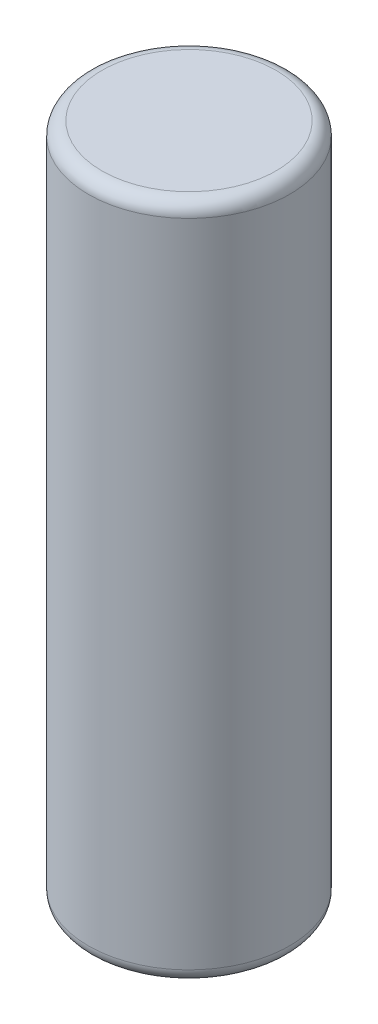
ISO-10303-21;
HEADER;
FILE_DESCRIPTION(('STEP AP214'),'2;1');
FILE_NAME('part.step','',(''),(''),'','','');
FILE_SCHEMA(('AUTOMOTIVE_DESIGN { 1 0 10303 214 1 1 1 1 }'));
ENDSEC;
DATA;
#1=APPLICATION_CONTEXT('core data for automotive mechanical design processes');
#2=APPLICATION_PROTOCOL_DEFINITION('international standard','automotive_design',2000,#1);
#3=PRODUCT_CONTEXT('',#1,'mechanical');
#4=PRODUCT('Part','Part','',(#3));
#5=PRODUCT_RELATED_PRODUCT_CATEGORY('part','',(#4));
#6=PRODUCT_DEFINITION_FORMATION('','',#4);
#7=PRODUCT_DEFINITION_CONTEXT('part definition',#1,'design');
#8=PRODUCT_DEFINITION('design','',#6,#7);
#9=PRODUCT_DEFINITION_SHAPE('','',#8);
#10=(LENGTH_UNIT() NAMED_UNIT(*) SI_UNIT(.MILLI.,.METRE.));
#11=(NAMED_UNIT(*) PLANE_ANGLE_UNIT() SI_UNIT($,.RADIAN.));
#12=(NAMED_UNIT(*) SI_UNIT($,.STERADIAN.) SOLID_ANGLE_UNIT());
#13=UNCERTAINTY_MEASURE_WITH_UNIT(LENGTH_MEASURE(1.E-05),#10,'distance_accuracy_value','');
#14=(GEOMETRIC_REPRESENTATION_CONTEXT(3) GLOBAL_UNCERTAINTY_ASSIGNED_CONTEXT((#13)) GLOBAL_UNIT_ASSIGNED_CONTEXT((#10,
#11,#12)) REPRESENTATION_CONTEXT('',''));
#15=CARTESIAN_POINT('',(0.,0.,0.));
#16=DIRECTION('',(0.,0.,1.));
#17=DIRECTION('',(1.,0.,0.));
#18=AXIS2_PLACEMENT_3D('',#15,#16,#17);
#19=CARTESIAN_POINT('',(0.,50.,0.));
#20=DIRECTION('',(0.,-1.,0.));
#21=DIRECTION('',(0.,0.,-1.));
#22=AXIS2_PLACEMENT_3D('',#19,#20,#21);
#23=CYLINDRICAL_SURFACE('',#22,7.425);
#24=CARTESIAN_POINT('',(0.,1.,0.));
#25=DIRECTION('',(0.,1.,0.));
#26=DIRECTION('',(0.,0.,1.));
#27=AXIS2_PLACEMENT_3D('',#24,#25,#26);
#28=CIRCLE('',#27,7.425);
#29=CARTESIAN_POINT('',(0.,1.,7.425));
#30=VERTEX_POINT('',#29);
#31=EDGE_CURVE('E48',#30,#30,#28,.T.);
#32=ORIENTED_EDGE('',*,*,#31,.T.);
#33=EDGE_LOOP('',(#32));
#34=FACE_BOUND('',#33,.T.);
#35=CARTESIAN_POINT('',(0.,49.,0.));
#36=DIRECTION('',(0.,1.,0.));
#37=DIRECTION('',(0.,0.,1.));
#38=AXIS2_PLACEMENT_3D('',#35,#36,#37);
#39=CIRCLE('',#38,7.425);
#40=CARTESIAN_POINT('',(0.,49.,7.425));
#41=VERTEX_POINT('',#40);
#42=EDGE_CURVE('E52',#41,#41,#39,.F.);
#43=ORIENTED_EDGE('',*,*,#42,.T.);
#44=EDGE_LOOP('',(#43));
#45=FACE_BOUND('',#44,.T.);
#46=ADVANCED_FACE('F37',(#34,#45),#23,.T.);
#47=CARTESIAN_POINT('',(0.,50.,0.));
#48=DIRECTION('',(0.,1.,0.));
#49=DIRECTION('',(0.,0.,1.));
#50=AXIS2_PLACEMENT_3D('',#47,#48,#49);
#51=PLANE('',#50);
#52=CARTESIAN_POINT('',(0.,50.,0.));
#53=DIRECTION('',(0.,1.,0.));
#54=DIRECTION('',(0.,0.,1.));
#55=AXIS2_PLACEMENT_3D('',#52,#53,#54);
#56=CIRCLE('',#55,6.425);
#57=CARTESIAN_POINT('',(0.,50.,6.425));
#58=VERTEX_POINT('',#57);
#59=EDGE_CURVE('E10',#58,#58,#56,.T.);
#60=ORIENTED_EDGE('',*,*,#59,.T.);
#61=EDGE_LOOP('',(#60));
#62=FACE_BOUND('',#61,.T.);
#63=ADVANCED_FACE('F68',(#62),#51,.T.);
#64=CARTESIAN_POINT('',(0.,0.,0.));
#65=DIRECTION('',(0.,1.,0.));
#66=DIRECTION('',(0.,0.,1.));
#67=AXIS2_PLACEMENT_3D('',#64,#65,#66);
#68=PLANE('',#67);
#69=CARTESIAN_POINT('',(0.,0.,0.));
#70=DIRECTION('',(0.,1.,0.));
#71=DIRECTION('',(0.,0.,1.));
#72=AXIS2_PLACEMENT_3D('',#69,#70,#71);
#73=CIRCLE('',#72,6.425);
#74=CARTESIAN_POINT('',(0.,0.,6.425));
#75=VERTEX_POINT('',#74);
#76=EDGE_CURVE('E44',#75,#75,#73,.F.);
#77=ORIENTED_EDGE('',*,*,#76,.T.);
#78=EDGE_LOOP('',(#77));
#79=FACE_BOUND('',#78,.T.);
#80=ADVANCED_FACE('F65',(#79),#68,.F.);
#81=CARTESIAN_POINT('',(0.,1.,0.));
#82=DIRECTION('',(0.,1.,0.));
#83=DIRECTION('',(0.,0.,1.));
#84=AXIS2_PLACEMENT_3D('',#81,#82,#83);
#85=TOROIDAL_SURFACE('',#84,6.425,1.);
#86=ORIENTED_EDGE('',*,*,#76,.F.);
#87=EDGE_LOOP('',(#86));
#88=FACE_BOUND('',#87,.T.);
#89=ORIENTED_EDGE('',*,*,#31,.F.);
#90=EDGE_LOOP('',(#89));
#91=FACE_BOUND('',#90,.T.);
#92=ADVANCED_FACE('F61',(#88,#91),#85,.T.);
#93=CARTESIAN_POINT('',(0.,49.,0.));
#94=DIRECTION('',(0.,1.,0.));
#95=DIRECTION('',(0.,0.,1.));
#96=AXIS2_PLACEMENT_3D('',#93,#94,#95);
#97=TOROIDAL_SURFACE('',#96,6.425,1.);
#98=ORIENTED_EDGE('',*,*,#42,.F.);
#99=EDGE_LOOP('',(#98));
#100=FACE_BOUND('',#99,.T.);
#101=ORIENTED_EDGE('',*,*,#59,.F.);
#102=EDGE_LOOP('',(#101));
#103=FACE_BOUND('',#102,.T.);
#104=ADVANCED_FACE('F39',(#100,#103),#97,.T.);
#105=CLOSED_SHELL('',(#46,#63,#80,#92,#104));
#106=MANIFOLD_SOLID_BREP('B2',#105);
#107=ADVANCED_BREP_SHAPE_REPRESENTATION('',(#18,#106),#14);
#108=SHAPE_DEFINITION_REPRESENTATION(#9,#107);
ENDSEC;
END-ISO-10303-21;
